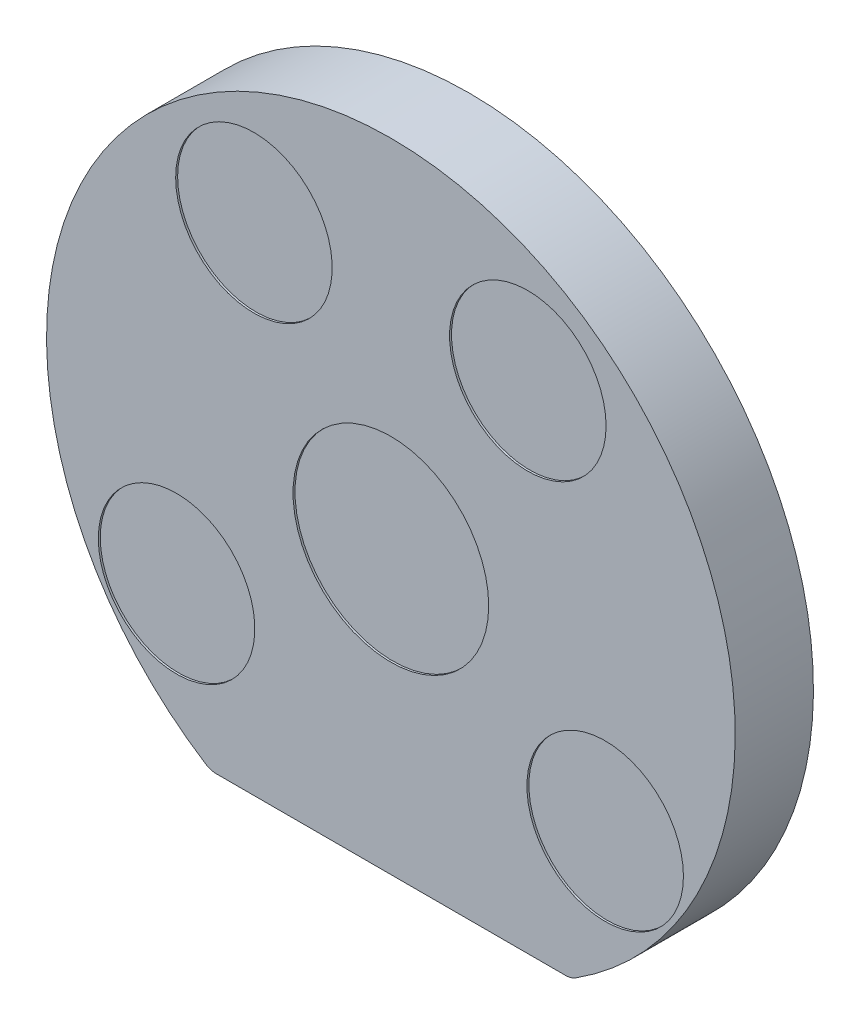
ISO-10303-21;
HEADER;
FILE_DESCRIPTION(('STEP AP214'),'2;1');
FILE_NAME('part.step','',(''),(''),'','','');
FILE_SCHEMA(('AUTOMOTIVE_DESIGN { 1 0 10303 214 1 1 1 1 }'));
ENDSEC;
DATA;
#1=APPLICATION_CONTEXT('core data for automotive mechanical design processes');
#2=APPLICATION_PROTOCOL_DEFINITION('international standard','automotive_design',2000,#1);
#3=PRODUCT_CONTEXT('',#1,'mechanical');
#4=PRODUCT('Part','Part','',(#3));
#5=PRODUCT_RELATED_PRODUCT_CATEGORY('part','',(#4));
#6=PRODUCT_DEFINITION_FORMATION('','',#4);
#7=PRODUCT_DEFINITION_CONTEXT('part definition',#1,'design');
#8=PRODUCT_DEFINITION('design','',#6,#7);
#9=PRODUCT_DEFINITION_SHAPE('','',#8);
#10=(LENGTH_UNIT() NAMED_UNIT(*) SI_UNIT(.MILLI.,.METRE.));
#11=(NAMED_UNIT(*) PLANE_ANGLE_UNIT() SI_UNIT($,.RADIAN.));
#12=(NAMED_UNIT(*) SI_UNIT($,.STERADIAN.) SOLID_ANGLE_UNIT());
#13=UNCERTAINTY_MEASURE_WITH_UNIT(LENGTH_MEASURE(1.E-05),#10,'distance_accuracy_value','');
#14=(GEOMETRIC_REPRESENTATION_CONTEXT(3) GLOBAL_UNCERTAINTY_ASSIGNED_CONTEXT((#13)) GLOBAL_UNIT_ASSIGNED_CONTEXT((#10,
#11,#12)) REPRESENTATION_CONTEXT('',''));
#15=CARTESIAN_POINT('',(0.,0.,0.));
#16=DIRECTION('',(0.,0.,1.));
#17=DIRECTION('',(1.,0.,0.));
#18=AXIS2_PLACEMENT_3D('',#15,#16,#17);
#19=CARTESIAN_POINT('',(0.,-75.,-20.));
#20=DIRECTION('',(0.,-1.,0.));
#21=DIRECTION('',(0.,0.,-1.));
#22=AXIS2_PLACEMENT_3D('',#19,#20,#21);
#23=PLANE('',#22);
#24=DIRECTION('',(1.,0.,0.));
#25=VECTOR('',#24,1.);
#26=CARTESIAN_POINT('',(0.,-75.,-20.));
#27=LINE('',#26,#25);
#28=CARTESIAN_POINT('',(-44.5982062419555,-75.,-20.));
#29=VERTEX_POINT('',#28);
#30=CARTESIAN_POINT('',(44.5982062419555,-75.,-20.));
#31=VERTEX_POINT('',#30);
#32=EDGE_CURVE('E138',#29,#31,#27,.T.);
#33=ORIENTED_EDGE('',*,*,#32,.T.);
#34=DIRECTION('',(0.,0.,1.));
#35=VECTOR('',#34,1.);
#36=CARTESIAN_POINT('',(44.5982062419555,-75.,-20.));
#37=LINE('',#36,#35);
#38=CARTESIAN_POINT('',(44.5982062419555,-75.,0.));
#39=VERTEX_POINT('',#38);
#40=EDGE_CURVE('E159',#31,#39,#37,.T.);
#41=ORIENTED_EDGE('',*,*,#40,.T.);
#42=DIRECTION('',(1.,0.,0.));
#43=VECTOR('',#42,1.);
#44=CARTESIAN_POINT('',(0.,-75.,0.));
#45=LINE('',#44,#43);
#46=CARTESIAN_POINT('',(-44.5982062419555,-75.,0.));
#47=VERTEX_POINT('',#46);
#48=EDGE_CURVE('E144',#47,#39,#45,.T.);
#49=ORIENTED_EDGE('',*,*,#48,.F.);
#50=DIRECTION('',(0.,0.,1.));
#51=VECTOR('',#50,1.);
#52=CARTESIAN_POINT('',(-44.5982062419555,-75.,-20.));
#53=LINE('',#52,#51);
#54=EDGE_CURVE('E157',#47,#29,#53,.F.);
#55=ORIENTED_EDGE('',*,*,#54,.T.);
#56=EDGE_LOOP('',(#33,#41,#49,#55));
#57=FACE_BOUND('',#56,.T.);
#58=ADVANCED_FACE('F37',(#57),#23,.T.);
#59=CARTESIAN_POINT('',(0.,0.,-20.));
#60=DIRECTION('',(0.,0.,1.));
#61=DIRECTION('',(1.,0.,0.));
#62=AXIS2_PLACEMENT_3D('',#59,#60,#61);
#63=CYLINDRICAL_SURFACE('',#62,88.);
#64=CARTESIAN_POINT('',(0.,0.,0.));
#65=DIRECTION('',(0.,0.,1.));
#66=DIRECTION('',(1.,0.,0.));
#67=AXIS2_PLACEMENT_3D('',#64,#65,#66);
#68=CIRCLE('',#67,88.);
#69=CARTESIAN_POINT('',(47.2848451721938,-74.2168674698795,0.));
#70=VERTEX_POINT('',#69);
#71=CARTESIAN_POINT('',(-47.2848451721938,-74.2168674698795,0.));
#72=VERTEX_POINT('',#71);
#73=EDGE_CURVE('E142',#70,#72,#68,.T.);
#74=ORIENTED_EDGE('',*,*,#73,.F.);
#75=DIRECTION('',(0.,0.,1.));
#76=VECTOR('',#75,1.);
#77=CARTESIAN_POINT('',(47.2848451721938,-74.2168674698795,-20.));
#78=LINE('',#77,#76);
#79=CARTESIAN_POINT('',(47.2848451721938,-74.2168674698795,-20.));
#80=VERTEX_POINT('',#79);
#81=EDGE_CURVE('E58',#70,#80,#78,.F.);
#82=ORIENTED_EDGE('',*,*,#81,.T.);
#83=CARTESIAN_POINT('',(0.,0.,-20.));
#84=DIRECTION('',(0.,0.,1.));
#85=DIRECTION('',(1.,0.,0.));
#86=AXIS2_PLACEMENT_3D('',#83,#84,#85);
#87=CIRCLE('',#86,88.);
#88=CARTESIAN_POINT('',(-47.2848451721938,-74.2168674698795,-20.));
#89=VERTEX_POINT('',#88);
#90=EDGE_CURVE('E141',#80,#89,#87,.T.);
#91=ORIENTED_EDGE('',*,*,#90,.T.);
#92=DIRECTION('',(0.,0.,1.));
#93=VECTOR('',#92,1.);
#94=CARTESIAN_POINT('',(-47.2848451721938,-74.2168674698795,-20.));
#95=LINE('',#94,#93);
#96=EDGE_CURVE('E166',#89,#72,#95,.T.);
#97=ORIENTED_EDGE('',*,*,#96,.T.);
#98=EDGE_LOOP('',(#74,#82,#91,#97));
#99=FACE_BOUND('',#98,.T.);
#100=ADVANCED_FACE('F170',(#99),#63,.T.);
#101=CARTESIAN_POINT('',(0.,0.,-20.));
#102=DIRECTION('',(0.,0.,1.));
#103=DIRECTION('',(1.,0.,0.));
#104=AXIS2_PLACEMENT_3D('',#101,#102,#103);
#105=PLANE('',#104);
#106=DIRECTION('',(-1.,0.,0.));
#107=VECTOR('',#106,1.);
#108=CARTESIAN_POINT('',(43.1161222746202,-65.,-20.));
#109=LINE('',#108,#107);
#110=CARTESIAN_POINT('',(39.9874980462644,-65.,-20.));
#111=VERTEX_POINT('',#110);
#112=CARTESIAN_POINT('',(-39.9874980462644,-65.,-20.));
#113=VERTEX_POINT('',#112);
#114=EDGE_CURVE('E127',#111,#113,#109,.T.);
#115=ORIENTED_EDGE('',*,*,#114,.F.);
#116=CARTESIAN_POINT('',(39.9874980462644,-55.,-20.));
#117=DIRECTION('',(0.,0.,1.));
#118=DIRECTION('',(1.,0.,0.));
#119=AXIS2_PLACEMENT_3D('',#116,#117,#118);
#120=CIRCLE('',#119,10.);
#121=CARTESIAN_POINT('',(45.8680124648327,-63.0882352941176,-20.));
#122=VERTEX_POINT('',#121);
#123=EDGE_CURVE('E112',#111,#122,#120,.T.);
#124=ORIENTED_EDGE('',*,*,#123,.T.);
#125=CARTESIAN_POINT('',(0.,0.,-20.));
#126=DIRECTION('',(0.,0.,-1.));
#127=DIRECTION('',(-1.,0.,0.));
#128=AXIS2_PLACEMENT_3D('',#125,#126,#127);
#129=CIRCLE('',#128,78.);
#130=CARTESIAN_POINT('',(-45.8680124648327,-63.0882352941176,-20.));
#131=VERTEX_POINT('',#130);
#132=EDGE_CURVE('E119',#131,#122,#129,.T.);
#133=ORIENTED_EDGE('',*,*,#132,.F.);
#134=CARTESIAN_POINT('',(-39.9874980462644,-55.,-20.));
#135=DIRECTION('',(0.,0.,1.));
#136=DIRECTION('',(1.,0.,0.));
#137=AXIS2_PLACEMENT_3D('',#134,#135,#136);
#138=CIRCLE('',#137,10.);
#139=EDGE_CURVE('E102',#131,#113,#138,.T.);
#140=ORIENTED_EDGE('',*,*,#139,.T.);
#141=EDGE_LOOP('',(#115,#124,#133,#140));
#142=FACE_BOUND('',#141,.T.);
#143=ORIENTED_EDGE('',*,*,#90,.F.);
#144=CARTESIAN_POINT('',(44.5982062419555,-70.,-20.));
#145=DIRECTION('',(0.,0.,1.));
#146=DIRECTION('',(1.,0.,0.));
#147=AXIS2_PLACEMENT_3D('',#144,#145,#146);
#148=CIRCLE('',#147,5.);
#149=EDGE_CURVE('E11',#80,#31,#148,.F.);
#150=ORIENTED_EDGE('',*,*,#149,.T.);
#151=ORIENTED_EDGE('',*,*,#32,.F.);
#152=CARTESIAN_POINT('',(-44.5982062419555,-70.,-20.));
#153=DIRECTION('',(0.,0.,1.));
#154=DIRECTION('',(1.,0.,0.));
#155=AXIS2_PLACEMENT_3D('',#152,#153,#154);
#156=CIRCLE('',#155,5.);
#157=EDGE_CURVE('E45',#29,#89,#156,.F.);
#158=ORIENTED_EDGE('',*,*,#157,.T.);
#159=EDGE_LOOP('',(#143,#150,#151,#158));
#160=FACE_BOUND('',#159,.T.);
#161=ADVANCED_FACE('F126',(#142,#160),#105,.F.);
#162=CARTESIAN_POINT('',(0.,0.,0.));
#163=DIRECTION('',(0.,0.,1.));
#164=DIRECTION('',(1.,0.,0.));
#165=AXIS2_PLACEMENT_3D('',#162,#163,#164);
#166=PLANE('',#165);
#167=CARTESIAN_POINT('',(35.,51.77,0.));
#168=DIRECTION('',(0.,0.,1.));
#169=DIRECTION('',(1.,0.,0.));
#170=AXIS2_PLACEMENT_3D('',#167,#168,#169);
#171=CIRCLE('',#170,20.);
#172=CARTESIAN_POINT('',(55.,51.77,0.));
#173=VERTEX_POINT('',#172);
#174=EDGE_CURVE('E231',#173,#173,#171,.T.);
#175=ORIENTED_EDGE('',*,*,#174,.F.);
#176=EDGE_LOOP('',(#175));
#177=FACE_BOUND('',#176,.T.);
#178=CARTESIAN_POINT('',(54.77,-38.,0.));
#179=DIRECTION('',(0.,0.,1.));
#180=DIRECTION('',(1.,0.,0.));
#181=AXIS2_PLACEMENT_3D('',#178,#179,#180);
#182=CIRCLE('',#181,20.);
#183=CARTESIAN_POINT('',(74.77,-38.,0.));
#184=VERTEX_POINT('',#183);
#185=EDGE_CURVE('E225',#184,#184,#182,.T.);
#186=ORIENTED_EDGE('',*,*,#185,.F.);
#187=EDGE_LOOP('',(#186));
#188=FACE_BOUND('',#187,.T.);
#189=CARTESIAN_POINT('',(-54.77,-38.,0.));
#190=DIRECTION('',(0.,0.,1.));
#191=DIRECTION('',(-1.,0.,0.));
#192=AXIS2_PLACEMENT_3D('',#189,#190,#191);
#193=CIRCLE('',#192,20.);
#194=CARTESIAN_POINT('',(-74.77,-38.,0.));
#195=VERTEX_POINT('',#194);
#196=EDGE_CURVE('E219',#195,#195,#193,.T.);
#197=ORIENTED_EDGE('',*,*,#196,.F.);
#198=EDGE_LOOP('',(#197));
#199=FACE_BOUND('',#198,.T.);
#200=CARTESIAN_POINT('',(-35.,51.77,0.));
#201=DIRECTION('',(0.,0.,1.));
#202=DIRECTION('',(-1.,0.,0.));
#203=AXIS2_PLACEMENT_3D('',#200,#201,#202);
#204=CIRCLE('',#203,20.);
#205=CARTESIAN_POINT('',(-55.,51.77,0.));
#206=VERTEX_POINT('',#205);
#207=EDGE_CURVE('E213',#206,#206,#204,.T.);
#208=ORIENTED_EDGE('',*,*,#207,.F.);
#209=EDGE_LOOP('',(#208));
#210=FACE_BOUND('',#209,.T.);
#211=CARTESIAN_POINT('',(0.,-3.,0.));
#212=DIRECTION('',(0.,0.,1.));
#213=DIRECTION('',(1.,0.,0.));
#214=AXIS2_PLACEMENT_3D('',#211,#212,#213);
#215=CIRCLE('',#214,25.);
#216=CARTESIAN_POINT('',(25.,-3.,0.));
#217=VERTEX_POINT('',#216);
#218=EDGE_CURVE('E132',#217,#217,#215,.T.);
#219=ORIENTED_EDGE('',*,*,#218,.F.);
#220=EDGE_LOOP('',(#219));
#221=FACE_BOUND('',#220,.T.);
#222=ORIENTED_EDGE('',*,*,#48,.T.);
#223=CARTESIAN_POINT('',(44.5982062419555,-70.,0.));
#224=DIRECTION('',(0.,0.,1.));
#225=DIRECTION('',(1.,0.,0.));
#226=AXIS2_PLACEMENT_3D('',#223,#224,#225);
#227=CIRCLE('',#226,5.);
#228=EDGE_CURVE('E164',#39,#70,#227,.T.);
#229=ORIENTED_EDGE('',*,*,#228,.T.);
#230=ORIENTED_EDGE('',*,*,#73,.T.);
#231=CARTESIAN_POINT('',(-44.5982062419555,-70.,0.));
#232=DIRECTION('',(0.,0.,1.));
#233=DIRECTION('',(1.,0.,0.));
#234=AXIS2_PLACEMENT_3D('',#231,#232,#233);
#235=CIRCLE('',#234,5.);
#236=EDGE_CURVE('E162',#72,#47,#235,.T.);
#237=ORIENTED_EDGE('',*,*,#236,.T.);
#238=EDGE_LOOP('',(#222,#229,#230,#237));
#239=FACE_BOUND('',#238,.T.);
#240=ADVANCED_FACE('F173',(#177,#188,#199,#210,#221,#239),#166,.T.);
#241=CARTESIAN_POINT('',(0.,0.,-3.));
#242=DIRECTION('',(0.,0.,-1.));
#243=DIRECTION('',(-1.,0.,0.));
#244=AXIS2_PLACEMENT_3D('',#241,#242,#243);
#245=CYLINDRICAL_SURFACE('',#244,78.);
#246=CARTESIAN_POINT('',(0.,0.,-3.));
#247=DIRECTION('',(0.,0.,-1.));
#248=DIRECTION('',(-1.,0.,0.));
#249=AXIS2_PLACEMENT_3D('',#246,#247,#248);
#250=CIRCLE('',#249,78.);
#251=CARTESIAN_POINT('',(-45.8680124648327,-63.0882352941176,-3.));
#252=VERTEX_POINT('',#251);
#253=CARTESIAN_POINT('',(45.8680124648327,-63.0882352941176,-3.));
#254=VERTEX_POINT('',#253);
#255=EDGE_CURVE('E122',#252,#254,#250,.T.);
#256=ORIENTED_EDGE('',*,*,#255,.F.);
#257=DIRECTION('',(0.,0.,-1.));
#258=VECTOR('',#257,1.);
#259=CARTESIAN_POINT('',(-45.8680124648327,-63.0882352941177,-3.));
#260=LINE('',#259,#258);
#261=EDGE_CURVE('E106',#252,#131,#260,.T.);
#262=ORIENTED_EDGE('',*,*,#261,.T.);
#263=ORIENTED_EDGE('',*,*,#132,.T.);
#264=DIRECTION('',(0.,0.,-1.));
#265=VECTOR('',#264,1.);
#266=CARTESIAN_POINT('',(45.8680124648327,-63.0882352941177,-3.));
#267=LINE('',#266,#265);
#268=EDGE_CURVE('E124',#122,#254,#267,.F.);
#269=ORIENTED_EDGE('',*,*,#268,.T.);
#270=EDGE_LOOP('',(#256,#262,#263,#269));
#271=FACE_BOUND('',#270,.T.);
#272=ADVANCED_FACE('F118',(#271),#245,.F.);
#273=CARTESIAN_POINT('',(43.1161222746202,-65.,-3.));
#274=DIRECTION('',(0.,-1.,0.));
#275=DIRECTION('',(0.,0.,-1.));
#276=AXIS2_PLACEMENT_3D('',#273,#274,#275);
#277=PLANE('',#276);
#278=ORIENTED_EDGE('',*,*,#114,.T.);
#279=DIRECTION('',(0.,0.,1.));
#280=VECTOR('',#279,1.);
#281=CARTESIAN_POINT('',(-39.9874980462644,-65.,-3.));
#282=LINE('',#281,#280);
#283=CARTESIAN_POINT('',(-39.9874980462644,-65.,-3.));
#284=VERTEX_POINT('',#283);
#285=EDGE_CURVE('E107',#113,#284,#282,.T.);
#286=ORIENTED_EDGE('',*,*,#285,.T.);
#287=DIRECTION('',(-1.,0.,0.));
#288=VECTOR('',#287,1.);
#289=CARTESIAN_POINT('',(43.1161222746202,-65.,-3.));
#290=LINE('',#289,#288);
#291=CARTESIAN_POINT('',(39.9874980462644,-65.,-3.));
#292=VERTEX_POINT('',#291);
#293=EDGE_CURVE('E135',#292,#284,#290,.T.);
#294=ORIENTED_EDGE('',*,*,#293,.F.);
#295=DIRECTION('',(0.,0.,1.));
#296=VECTOR('',#295,1.);
#297=CARTESIAN_POINT('',(39.9874980462644,-65.,-20.));
#298=LINE('',#297,#296);
#299=EDGE_CURVE('E123',#292,#111,#298,.F.);
#300=ORIENTED_EDGE('',*,*,#299,.T.);
#301=EDGE_LOOP('',(#278,#286,#294,#300));
#302=FACE_BOUND('',#301,.T.);
#303=ADVANCED_FACE('F208',(#302),#277,.F.);
#304=CARTESIAN_POINT('',(0.,0.,-3.));
#305=DIRECTION('',(0.,0.,-1.));
#306=DIRECTION('',(-1.,0.,0.));
#307=AXIS2_PLACEMENT_3D('',#304,#305,#306);
#308=PLANE('',#307);
#309=ORIENTED_EDGE('',*,*,#293,.T.);
#310=CARTESIAN_POINT('',(-39.9874980462644,-55.,-3.));
#311=DIRECTION('',(0.,0.,-1.));
#312=DIRECTION('',(-1.,0.,0.));
#313=AXIS2_PLACEMENT_3D('',#310,#311,#312);
#314=CIRCLE('',#313,10.);
#315=EDGE_CURVE('E113',#284,#252,#314,.T.);
#316=ORIENTED_EDGE('',*,*,#315,.T.);
#317=ORIENTED_EDGE('',*,*,#255,.T.);
#318=CARTESIAN_POINT('',(39.9874980462644,-55.,-3.));
#319=DIRECTION('',(0.,0.,-1.));
#320=DIRECTION('',(-1.,0.,0.));
#321=AXIS2_PLACEMENT_3D('',#318,#319,#320);
#322=CIRCLE('',#321,10.);
#323=EDGE_CURVE('E153',#254,#292,#322,.T.);
#324=ORIENTED_EDGE('',*,*,#323,.T.);
#325=EDGE_LOOP('',(#309,#316,#317,#324));
#326=FACE_BOUND('',#325,.T.);
#327=ADVANCED_FACE('F206',(#326),#308,.T.);
#328=CARTESIAN_POINT('',(0.,-3.,-0.5));
#329=DIRECTION('',(0.,0.,1.));
#330=DIRECTION('',(1.,0.,0.));
#331=AXIS2_PLACEMENT_3D('',#328,#329,#330);
#332=CYLINDRICAL_SURFACE('',#331,25.);
#333=CARTESIAN_POINT('',(0.,-3.,-0.5));
#334=DIRECTION('',(0.,0.,1.));
#335=DIRECTION('',(1.,0.,0.));
#336=AXIS2_PLACEMENT_3D('',#333,#334,#335);
#337=CIRCLE('',#336,25.);
#338=CARTESIAN_POINT('',(25.,-3.,-0.5));
#339=VERTEX_POINT('',#338);
#340=EDGE_CURVE('E128',#339,#339,#337,.T.);
#341=ORIENTED_EDGE('',*,*,#340,.F.);
#342=EDGE_LOOP('',(#341));
#343=FACE_BOUND('',#342,.T.);
#344=ORIENTED_EDGE('',*,*,#218,.T.);
#345=EDGE_LOOP('',(#344));
#346=FACE_BOUND('',#345,.T.);
#347=ADVANCED_FACE('F255',(#343,#346),#332,.F.);
#348=CARTESIAN_POINT('',(0.,-3.,-0.5));
#349=DIRECTION('',(0.,0.,1.));
#350=DIRECTION('',(1.,0.,0.));
#351=AXIS2_PLACEMENT_3D('',#348,#349,#350);
#352=PLANE('',#351);
#353=ORIENTED_EDGE('',*,*,#340,.T.);
#354=EDGE_LOOP('',(#353));
#355=FACE_BOUND('',#354,.T.);
#356=ADVANCED_FACE('F257',(#355),#352,.T.);
#357=CARTESIAN_POINT('',(-35.,51.77,-0.5));
#358=DIRECTION('',(0.,0.,1.));
#359=DIRECTION('',(1.,0.,0.));
#360=AXIS2_PLACEMENT_3D('',#357,#358,#359);
#361=CYLINDRICAL_SURFACE('',#360,20.);
#362=CARTESIAN_POINT('',(-35.,51.77,-0.5));
#363=DIRECTION('',(0.,0.,1.));
#364=DIRECTION('',(-1.,0.,0.));
#365=AXIS2_PLACEMENT_3D('',#362,#363,#364);
#366=CIRCLE('',#365,20.);
#367=CARTESIAN_POINT('',(-55.,51.77,-0.5));
#368=VERTEX_POINT('',#367);
#369=EDGE_CURVE('E216',#368,#368,#366,.T.);
#370=ORIENTED_EDGE('',*,*,#369,.F.);
#371=EDGE_LOOP('',(#370));
#372=FACE_BOUND('',#371,.T.);
#373=ORIENTED_EDGE('',*,*,#207,.T.);
#374=EDGE_LOOP('',(#373));
#375=FACE_BOUND('',#374,.T.);
#376=ADVANCED_FACE('F264',(#372,#375),#361,.F.);
#377=CARTESIAN_POINT('',(-35.,51.77,-0.5));
#378=DIRECTION('',(0.,0.,-1.));
#379=DIRECTION('',(-1.,0.,0.));
#380=AXIS2_PLACEMENT_3D('',#377,#378,#379);
#381=PLANE('',#380);
#382=ORIENTED_EDGE('',*,*,#369,.T.);
#383=EDGE_LOOP('',(#382));
#384=FACE_BOUND('',#383,.T.);
#385=ADVANCED_FACE('F378',(#384),#381,.F.);
#386=CARTESIAN_POINT('',(-54.77,-38.,-0.5));
#387=DIRECTION('',(0.,0.,1.));
#388=DIRECTION('',(1.,0.,0.));
#389=AXIS2_PLACEMENT_3D('',#386,#387,#388);
#390=CYLINDRICAL_SURFACE('',#389,20.);
#391=CARTESIAN_POINT('',(-54.77,-38.,-0.5));
#392=DIRECTION('',(0.,0.,1.));
#393=DIRECTION('',(-1.,0.,0.));
#394=AXIS2_PLACEMENT_3D('',#391,#392,#393);
#395=CIRCLE('',#394,20.);
#396=CARTESIAN_POINT('',(-74.77,-38.,-0.5));
#397=VERTEX_POINT('',#396);
#398=EDGE_CURVE('E222',#397,#397,#395,.T.);
#399=ORIENTED_EDGE('',*,*,#398,.F.);
#400=EDGE_LOOP('',(#399));
#401=FACE_BOUND('',#400,.T.);
#402=ORIENTED_EDGE('',*,*,#196,.T.);
#403=EDGE_LOOP('',(#402));
#404=FACE_BOUND('',#403,.T.);
#405=ADVANCED_FACE('F371',(#401,#404),#390,.F.);
#406=CARTESIAN_POINT('',(-54.77,-38.,-0.5));
#407=DIRECTION('',(0.,0.,-1.));
#408=DIRECTION('',(-1.,0.,0.));
#409=AXIS2_PLACEMENT_3D('',#406,#407,#408);
#410=PLANE('',#409);
#411=ORIENTED_EDGE('',*,*,#398,.T.);
#412=EDGE_LOOP('',(#411));
#413=FACE_BOUND('',#412,.T.);
#414=ADVANCED_FACE('F363',(#413),#410,.F.);
#415=CARTESIAN_POINT('',(54.77,-38.,-0.5));
#416=DIRECTION('',(0.,0.,1.));
#417=DIRECTION('',(1.,0.,0.));
#418=AXIS2_PLACEMENT_3D('',#415,#416,#417);
#419=CYLINDRICAL_SURFACE('',#418,20.);
#420=CARTESIAN_POINT('',(54.77,-38.,-0.5));
#421=DIRECTION('',(0.,0.,1.));
#422=DIRECTION('',(1.,0.,0.));
#423=AXIS2_PLACEMENT_3D('',#420,#421,#422);
#424=CIRCLE('',#423,20.);
#425=CARTESIAN_POINT('',(74.77,-38.,-0.5));
#426=VERTEX_POINT('',#425);
#427=EDGE_CURVE('E228',#426,#426,#424,.T.);
#428=ORIENTED_EDGE('',*,*,#427,.F.);
#429=EDGE_LOOP('',(#428));
#430=FACE_BOUND('',#429,.T.);
#431=ORIENTED_EDGE('',*,*,#185,.T.);
#432=EDGE_LOOP('',(#431));
#433=FACE_BOUND('',#432,.T.);
#434=ADVANCED_FACE('F355',(#430,#433),#419,.F.);
#435=CARTESIAN_POINT('',(54.77,-38.,-0.5));
#436=DIRECTION('',(0.,0.,1.));
#437=DIRECTION('',(1.,0.,0.));
#438=AXIS2_PLACEMENT_3D('',#435,#436,#437);
#439=PLANE('',#438);
#440=ORIENTED_EDGE('',*,*,#427,.T.);
#441=EDGE_LOOP('',(#440));
#442=FACE_BOUND('',#441,.T.);
#443=ADVANCED_FACE('F241',(#442),#439,.T.);
#444=CARTESIAN_POINT('',(35.,51.77,-0.5));
#445=DIRECTION('',(0.,0.,1.));
#446=DIRECTION('',(1.,0.,0.));
#447=AXIS2_PLACEMENT_3D('',#444,#445,#446);
#448=CYLINDRICAL_SURFACE('',#447,20.);
#449=CARTESIAN_POINT('',(35.,51.77,-0.5));
#450=DIRECTION('',(0.,0.,1.));
#451=DIRECTION('',(1.,0.,0.));
#452=AXIS2_PLACEMENT_3D('',#449,#450,#451);
#453=CIRCLE('',#452,20.);
#454=CARTESIAN_POINT('',(55.,51.77,-0.5));
#455=VERTEX_POINT('',#454);
#456=EDGE_CURVE('E211',#455,#455,#453,.T.);
#457=ORIENTED_EDGE('',*,*,#456,.F.);
#458=EDGE_LOOP('',(#457));
#459=FACE_BOUND('',#458,.T.);
#460=ORIENTED_EDGE('',*,*,#174,.T.);
#461=EDGE_LOOP('',(#460));
#462=FACE_BOUND('',#461,.T.);
#463=ADVANCED_FACE('F238',(#459,#462),#448,.F.);
#464=CARTESIAN_POINT('',(35.,51.77,-0.5));
#465=DIRECTION('',(0.,0.,1.));
#466=DIRECTION('',(1.,0.,0.));
#467=AXIS2_PLACEMENT_3D('',#464,#465,#466);
#468=PLANE('',#467);
#469=ORIENTED_EDGE('',*,*,#456,.T.);
#470=EDGE_LOOP('',(#469));
#471=FACE_BOUND('',#470,.T.);
#472=ADVANCED_FACE('F196',(#471),#468,.T.);
#473=CARTESIAN_POINT('',(-39.9874980462644,-55.,-3.));
#474=DIRECTION('',(0.,0.,-1.));
#475=DIRECTION('',(-1.,0.,0.));
#476=AXIS2_PLACEMENT_3D('',#473,#474,#475);
#477=CYLINDRICAL_SURFACE('',#476,10.);
#478=ORIENTED_EDGE('',*,*,#315,.F.);
#479=ORIENTED_EDGE('',*,*,#285,.F.);
#480=ORIENTED_EDGE('',*,*,#139,.F.);
#481=ORIENTED_EDGE('',*,*,#261,.F.);
#482=EDGE_LOOP('',(#478,#479,#480,#481));
#483=FACE_BOUND('',#482,.T.);
#484=ADVANCED_FACE('F105',(#483),#477,.F.);
#485=CARTESIAN_POINT('',(39.9874980462644,-55.,-3.));
#486=DIRECTION('',(0.,0.,-1.));
#487=DIRECTION('',(-1.,0.,0.));
#488=AXIS2_PLACEMENT_3D('',#485,#486,#487);
#489=CYLINDRICAL_SURFACE('',#488,10.);
#490=ORIENTED_EDGE('',*,*,#323,.F.);
#491=ORIENTED_EDGE('',*,*,#268,.F.);
#492=ORIENTED_EDGE('',*,*,#123,.F.);
#493=ORIENTED_EDGE('',*,*,#299,.F.);
#494=EDGE_LOOP('',(#490,#491,#492,#493));
#495=FACE_BOUND('',#494,.T.);
#496=ADVANCED_FACE('F185',(#495),#489,.F.);
#497=CARTESIAN_POINT('',(44.5982062419555,-70.,-20.));
#498=DIRECTION('',(0.,0.,1.));
#499=DIRECTION('',(1.,0.,0.));
#500=AXIS2_PLACEMENT_3D('',#497,#498,#499);
#501=CYLINDRICAL_SURFACE('',#500,5.);
#502=ORIENTED_EDGE('',*,*,#149,.F.);
#503=ORIENTED_EDGE('',*,*,#81,.F.);
#504=ORIENTED_EDGE('',*,*,#228,.F.);
#505=ORIENTED_EDGE('',*,*,#40,.F.);
#506=EDGE_LOOP('',(#502,#503,#504,#505));
#507=FACE_BOUND('',#506,.T.);
#508=ADVANCED_FACE('F178',(#507),#501,.T.);
#509=CARTESIAN_POINT('',(-44.5982062419555,-70.,-20.));
#510=DIRECTION('',(0.,0.,1.));
#511=DIRECTION('',(1.,0.,0.));
#512=AXIS2_PLACEMENT_3D('',#509,#510,#511);
#513=CYLINDRICAL_SURFACE('',#512,5.);
#514=ORIENTED_EDGE('',*,*,#157,.F.);
#515=ORIENTED_EDGE('',*,*,#54,.F.);
#516=ORIENTED_EDGE('',*,*,#236,.F.);
#517=ORIENTED_EDGE('',*,*,#96,.F.);
#518=EDGE_LOOP('',(#514,#515,#516,#517));
#519=FACE_BOUND('',#518,.T.);
#520=ADVANCED_FACE('F39',(#519),#513,.T.);
#521=CLOSED_SHELL('',(#58,#100,#161,#240,#272,#303,#327,#347,#356,#376,#385,#405,#414,#434,#443,
#463,#472,#484,#496,#508,#520));
#522=MANIFOLD_SOLID_BREP('B2',#521);
#523=ADVANCED_BREP_SHAPE_REPRESENTATION('',(#18,#522),#14);
#524=SHAPE_DEFINITION_REPRESENTATION(#9,#523);
ENDSEC;
END-ISO-10303-21;
